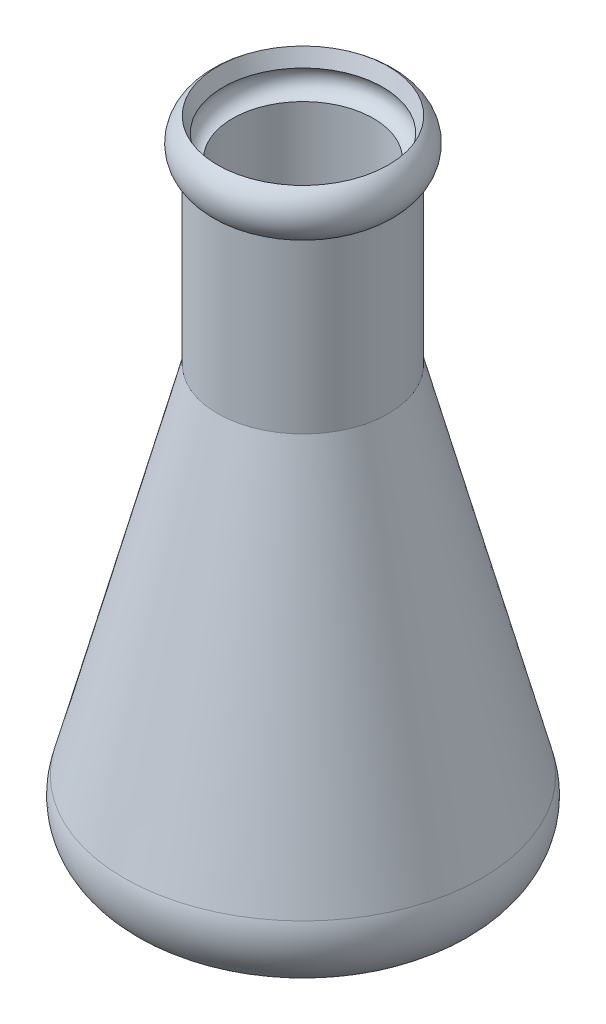
ISO-10303-21;
HEADER;
FILE_DESCRIPTION(('STEP AP214'),'2;1');
FILE_NAME('part.step','',(''),(''),'','','');
FILE_SCHEMA(('AUTOMOTIVE_DESIGN { 1 0 10303 214 1 1 1 1 }'));
ENDSEC;
DATA;
#1=APPLICATION_CONTEXT('core data for automotive mechanical design processes');
#2=APPLICATION_PROTOCOL_DEFINITION('international standard','automotive_design',2000,#1);
#3=PRODUCT_CONTEXT('',#1,'mechanical');
#4=PRODUCT('Part','Part','',(#3));
#5=PRODUCT_RELATED_PRODUCT_CATEGORY('part','',(#4));
#6=PRODUCT_DEFINITION_FORMATION('','',#4);
#7=PRODUCT_DEFINITION_CONTEXT('part definition',#1,'design');
#8=PRODUCT_DEFINITION('design','',#6,#7);
#9=PRODUCT_DEFINITION_SHAPE('','',#8);
#10=(LENGTH_UNIT() NAMED_UNIT(*) SI_UNIT(.MILLI.,.METRE.));
#11=(NAMED_UNIT(*) PLANE_ANGLE_UNIT() SI_UNIT($,.RADIAN.));
#12=(NAMED_UNIT(*) SI_UNIT($,.STERADIAN.) SOLID_ANGLE_UNIT());
#13=UNCERTAINTY_MEASURE_WITH_UNIT(LENGTH_MEASURE(1.E-05),#10,'distance_accuracy_value','');
#14=(GEOMETRIC_REPRESENTATION_CONTEXT(3) GLOBAL_UNCERTAINTY_ASSIGNED_CONTEXT((#13)) GLOBAL_UNIT_ASSIGNED_CONTEXT((#10,
#11,#12)) REPRESENTATION_CONTEXT('',''));
#15=CARTESIAN_POINT('',(0.,0.,0.));
#16=DIRECTION('',(0.,0.,1.));
#17=DIRECTION('',(1.,0.,0.));
#18=AXIS2_PLACEMENT_3D('',#15,#16,#17);
#19=CARTESIAN_POINT('',(0.,-85.,0.));
#20=DIRECTION('',(0.,-1.,0.));
#21=DIRECTION('',(1.,0.,0.));
#22=AXIS2_PLACEMENT_3D('',#19,#20,#21);
#23=PLANE('',#22);
#24=CARTESIAN_POINT('',(0.,-85.,0.));
#25=DIRECTION('',(0.,-1.,0.));
#26=DIRECTION('',(1.,0.,0.));
#27=AXIS2_PLACEMENT_3D('',#24,#25,#26);
#28=CIRCLE('',#27,20.3122122689348);
#29=CARTESIAN_POINT('',(20.3122122689348,-85.,0.));
#30=VERTEX_POINT('',#29);
#31=EDGE_CURVE('E10',#30,#30,#28,.T.);
#32=ORIENTED_EDGE('',*,*,#31,.T.);
#33=EDGE_LOOP('',(#32));
#34=FACE_BOUND('',#33,.T.);
#35=ADVANCED_FACE('F40',(#34),#23,.T.);
#36=CARTESIAN_POINT('',(0.,-78.314900575015,0.));
#37=DIRECTION('',(0.,-1.,0.));
#38=DIRECTION('',(1.,0.,0.));
#39=AXIS2_PLACEMENT_3D('',#36,#37,#38);
#40=TOROIDAL_SURFACE('',#39,16.3909975706911,7.75025670746823);
#41=CARTESIAN_POINT('',(0.,-76.0052608226649,0.));
#42=DIRECTION('',(0.,-1.,0.));
#43=DIRECTION('',(1.,0.,0.));
#44=AXIS2_PLACEMENT_3D('',#41,#42,#43);
#45=CIRCLE('',#44,23.789108359671);
#46=CARTESIAN_POINT('',(23.789108359671,-76.0052608226649,0.));
#47=VERTEX_POINT('',#46);
#48=EDGE_CURVE('E47',#47,#47,#45,.T.);
#49=ORIENTED_EDGE('',*,*,#48,.T.);
#50=EDGE_LOOP('',(#49));
#51=FACE_BOUND('',#50,.T.);
#52=ORIENTED_EDGE('',*,*,#31,.F.);
#53=EDGE_LOOP('',(#52));
#54=FACE_BOUND('',#53,.T.);
#55=ADVANCED_FACE('F100',(#51,#54),#40,.T.);
#56=CARTESIAN_POINT('',(0.,-76.0052608226649,0.));
#57=DIRECTION('',(0.,-1.,0.));
#58=DIRECTION('',(1.,0.,0.));
#59=AXIS2_PLACEMENT_3D('',#56,#57,#58);
#60=CONICAL_SURFACE('',#59,23.789108359671,0.256525815101251);
#61=CARTESIAN_POINT('',(0.,-28.6551581831815,0.));
#62=DIRECTION('',(0.,-1.,0.));
#63=DIRECTION('',(1.,0.,0.));
#64=AXIS2_PLACEMENT_3D('',#61,#62,#63);
#65=CIRCLE('',#64,11.3689435901247);
#66=CARTESIAN_POINT('',(11.3689435901247,-28.6551581831815,0.));
#67=VERTEX_POINT('',#66);
#68=EDGE_CURVE('E52',#67,#67,#65,.T.);
#69=ORIENTED_EDGE('',*,*,#68,.T.);
#70=EDGE_LOOP('',(#69));
#71=FACE_BOUND('',#70,.T.);
#72=ORIENTED_EDGE('',*,*,#48,.F.);
#73=EDGE_LOOP('',(#72));
#74=FACE_BOUND('',#73,.T.);
#75=ADVANCED_FACE('F104',(#71,#74),#60,.T.);
#76=CARTESIAN_POINT('',(0.,-85.,0.));
#77=DIRECTION('',(0.,-1.,0.));
#78=DIRECTION('',(1.,0.,0.));
#79=AXIS2_PLACEMENT_3D('',#76,#77,#78);
#80=CYLINDRICAL_SURFACE('',#79,11.3689435901247);
#81=CARTESIAN_POINT('',(0.,-6.31512563328454,0.));
#82=DIRECTION('',(0.,-1.,0.));
#83=DIRECTION('',(1.,0.,0.));
#84=AXIS2_PLACEMENT_3D('',#81,#82,#83);
#85=CIRCLE('',#84,11.3689435901248);
#86=CARTESIAN_POINT('',(11.3689435901247,-6.31512563328454,0.));
#87=VERTEX_POINT('',#86);
#88=EDGE_CURVE('E57',#87,#87,#85,.T.);
#89=ORIENTED_EDGE('',*,*,#88,.T.);
#90=EDGE_LOOP('',(#89));
#91=FACE_BOUND('',#90,.T.);
#92=ORIENTED_EDGE('',*,*,#68,.F.);
#93=EDGE_LOOP('',(#92));
#94=FACE_BOUND('',#93,.T.);
#95=ADVANCED_FACE('F108',(#91,#94),#80,.T.);
#96=CARTESIAN_POINT('',(0.,-3.15756281664227,0.));
#97=DIRECTION('',(0.,-1.,0.));
#98=DIRECTION('',(1.,0.,0.));
#99=AXIS2_PLACEMENT_3D('',#96,#97,#98);
#100=TOROIDAL_SURFACE('',#99,9.18362176380115,3.84003052405162);
#101=CARTESIAN_POINT('',(0.,0.,0.));
#102=DIRECTION('',(0.,-1.,0.));
#103=DIRECTION('',(1.,0.,0.));
#104=AXIS2_PLACEMENT_3D('',#101,#102,#103);
#105=CIRCLE('',#104,11.3689435901247);
#106=CARTESIAN_POINT('',(11.3689435901247,0.,0.));
#107=VERTEX_POINT('',#106);
#108=EDGE_CURVE('E63',#107,#107,#105,.T.);
#109=ORIENTED_EDGE('',*,*,#108,.T.);
#110=EDGE_LOOP('',(#109));
#111=FACE_BOUND('',#110,.T.);
#112=ORIENTED_EDGE('',*,*,#88,.F.);
#113=EDGE_LOOP('',(#112));
#114=FACE_BOUND('',#113,.T.);
#115=ADVANCED_FACE('F115',(#111,#114),#100,.T.);
#116=CARTESIAN_POINT('',(0.,0.,0.));
#117=DIRECTION('',(0.,1.,0.));
#118=DIRECTION('',(-1.,0.,0.));
#119=AXIS2_PLACEMENT_3D('',#116,#117,#118);
#120=CONICAL_SURFACE('',#119,11.3689435901247,0.360969807118283);
#121=CARTESIAN_POINT('',(0.,-2.,0.));
#122=DIRECTION('',(0.,-1.,0.));
#123=DIRECTION('',(1.,0.,0.));
#124=AXIS2_PLACEMENT_3D('',#121,#122,#123);
#125=CIRCLE('',#124,10.613922660455);
#126=CARTESIAN_POINT('',(10.613922660455,-2.,0.));
#127=VERTEX_POINT('',#126);
#128=EDGE_CURVE('E67',#127,#127,#125,.T.);
#129=ORIENTED_EDGE('',*,*,#128,.T.);
#130=EDGE_LOOP('',(#129));
#131=FACE_BOUND('',#130,.T.);
#132=ORIENTED_EDGE('',*,*,#108,.F.);
#133=EDGE_LOOP('',(#132));
#134=FACE_BOUND('',#133,.T.);
#135=ADVANCED_FACE('F119',(#131,#134),#120,.F.);
#136=CARTESIAN_POINT('',(0.,-3.15756281664227,0.));
#137=DIRECTION('',(0.,-1.,0.));
#138=DIRECTION('',(1.,0.,0.));
#139=AXIS2_PLACEMENT_3D('',#136,#137,#138);
#140=TOROIDAL_SURFACE('',#139,9.18362176380115,1.84003052405162);
#141=CARTESIAN_POINT('',(0.,-4.988237050396,0.));
#142=DIRECTION('',(0.,-1.,0.));
#143=DIRECTION('',(1.,0.,0.));
#144=AXIS2_PLACEMENT_3D('',#141,#142,#143);
#145=CIRCLE('',#144,9.36894359012475);
#146=CARTESIAN_POINT('',(9.36894359012475,-4.988237050396,0.));
#147=VERTEX_POINT('',#146);
#148=EDGE_CURVE('E71',#147,#147,#145,.T.);
#149=ORIENTED_EDGE('',*,*,#148,.T.);
#150=EDGE_LOOP('',(#149));
#151=FACE_BOUND('',#150,.T.);
#152=ORIENTED_EDGE('',*,*,#128,.F.);
#153=EDGE_LOOP('',(#152));
#154=FACE_BOUND('',#153,.T.);
#155=ADVANCED_FACE('F123',(#151,#154),#140,.F.);
#156=CARTESIAN_POINT('',(0.,-85.,0.));
#157=DIRECTION('',(0.,-1.,0.));
#158=DIRECTION('',(1.,0.,0.));
#159=AXIS2_PLACEMENT_3D('',#156,#157,#158);
#160=CYLINDRICAL_SURFACE('',#159,9.36894359012475);
#161=CARTESIAN_POINT('',(0.,-28.9131000514157,0.));
#162=DIRECTION('',(0.,-1.,0.));
#163=DIRECTION('',(1.,0.,0.));
#164=AXIS2_PLACEMENT_3D('',#161,#162,#163);
#165=CIRCLE('',#164,9.36894359012475);
#166=CARTESIAN_POINT('',(9.36894359012475,-28.9131000514157,0.));
#167=VERTEX_POINT('',#166);
#168=EDGE_CURVE('E75',#167,#167,#165,.T.);
#169=ORIENTED_EDGE('',*,*,#168,.T.);
#170=EDGE_LOOP('',(#169));
#171=FACE_BOUND('',#170,.T.);
#172=ORIENTED_EDGE('',*,*,#148,.F.);
#173=EDGE_LOOP('',(#172));
#174=FACE_BOUND('',#173,.T.);
#175=ADVANCED_FACE('F127',(#171,#174),#160,.F.);
#176=CARTESIAN_POINT('',(0.,-28.9131000514157,0.));
#177=DIRECTION('',(0.,-1.,0.));
#178=DIRECTION('',(1.,0.,0.));
#179=AXIS2_PLACEMENT_3D('',#176,#177,#178);
#180=CONICAL_SURFACE('',#179,9.36894359012475,0.256525815101251);
#181=CARTESIAN_POINT('',(0.,-76.5606059813659,0.));
#182=DIRECTION('',(0.,-1.,0.));
#183=DIRECTION('',(1.,0.,0.));
#184=AXIS2_PLACEMENT_3D('',#181,#182,#183);
#185=CIRCLE('',#184,21.8671187052604);
#186=CARTESIAN_POINT('',(21.8671187052604,-76.5606059813659,0.));
#187=VERTEX_POINT('',#186);
#188=EDGE_CURVE('E79',#187,#187,#185,.T.);
#189=ORIENTED_EDGE('',*,*,#188,.T.);
#190=EDGE_LOOP('',(#189));
#191=FACE_BOUND('',#190,.T.);
#192=ORIENTED_EDGE('',*,*,#168,.F.);
#193=EDGE_LOOP('',(#192));
#194=FACE_BOUND('',#193,.T.);
#195=ADVANCED_FACE('F97',(#191,#194),#180,.F.);
#196=CARTESIAN_POINT('',(0.,-78.314900575015,0.));
#197=DIRECTION('',(0.,-1.,0.));
#198=DIRECTION('',(1.,0.,0.));
#199=AXIS2_PLACEMENT_3D('',#196,#197,#198);
#200=TOROIDAL_SURFACE('',#199,16.3909975706911,5.75025670746823);
#201=CARTESIAN_POINT('',(0.,-83.,0.));
#202=DIRECTION('',(0.,-1.,0.));
#203=DIRECTION('',(1.,0.,0.));
#204=AXIS2_PLACEMENT_3D('',#201,#202,#203);
#205=CIRCLE('',#204,19.7249585152417);
#206=CARTESIAN_POINT('',(19.7249585152417,-83.,0.));
#207=VERTEX_POINT('',#206);
#208=EDGE_CURVE('E83',#207,#207,#205,.T.);
#209=ORIENTED_EDGE('',*,*,#208,.T.);
#210=EDGE_LOOP('',(#209));
#211=FACE_BOUND('',#210,.T.);
#212=ORIENTED_EDGE('',*,*,#188,.F.);
#213=EDGE_LOOP('',(#212));
#214=FACE_BOUND('',#213,.T.);
#215=ADVANCED_FACE('F88',(#211,#214),#200,.F.);
#216=CARTESIAN_POINT('',(2.,-83.,0.));
#217=DIRECTION('',(0.,1.,0.));
#218=DIRECTION('',(-1.,0.,0.));
#219=AXIS2_PLACEMENT_3D('',#216,#217,#218);
#220=PLANE('',#219);
#221=ORIENTED_EDGE('',*,*,#208,.F.);
#222=EDGE_LOOP('',(#221));
#223=FACE_BOUND('',#222,.T.);
#224=ADVANCED_FACE('F91',(#223),#220,.T.);
#225=CLOSED_SHELL('',(#35,#55,#75,#95,#115,#135,#155,#175,#195,#215,#224));
#226=MANIFOLD_SOLID_BREP('B2',#225);
#227=ADVANCED_BREP_SHAPE_REPRESENTATION('',(#18,#226),#14);
#228=SHAPE_DEFINITION_REPRESENTATION(#9,#227);
ENDSEC;
END-ISO-10303-21;
